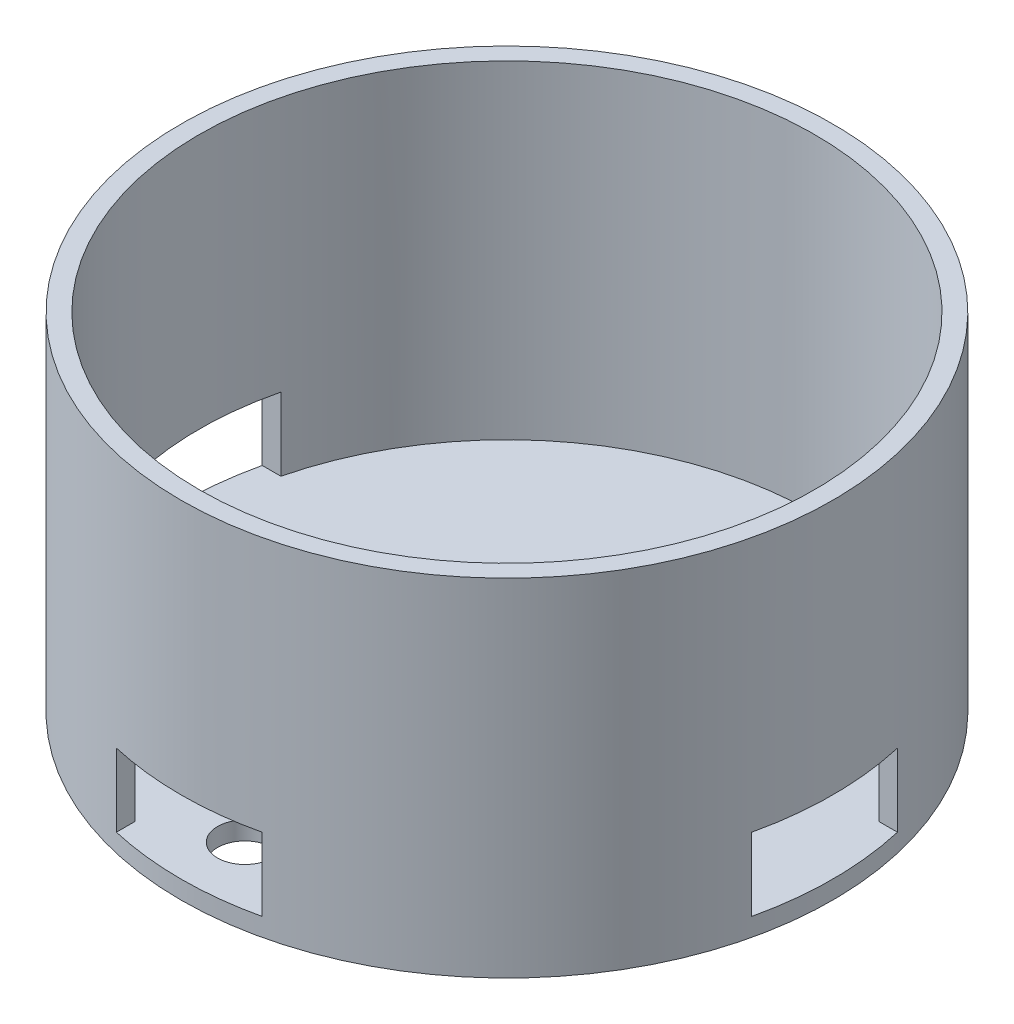
ISO-10303-21;
HEADER;
FILE_DESCRIPTION(('STEP AP214'),'2;1');
FILE_NAME('part.step','',(''),(''),'','','');
FILE_SCHEMA(('AUTOMOTIVE_DESIGN { 1 0 10303 214 1 1 1 1 }'));
ENDSEC;
DATA;
#1=APPLICATION_CONTEXT('core data for automotive mechanical design processes');
#2=APPLICATION_PROTOCOL_DEFINITION('international standard','automotive_design',2000,#1);
#3=PRODUCT_CONTEXT('',#1,'mechanical');
#4=PRODUCT('Part','Part','',(#3));
#5=PRODUCT_RELATED_PRODUCT_CATEGORY('part','',(#4));
#6=PRODUCT_DEFINITION_FORMATION('','',#4);
#7=PRODUCT_DEFINITION_CONTEXT('part definition',#1,'design');
#8=PRODUCT_DEFINITION('design','',#6,#7);
#9=PRODUCT_DEFINITION_SHAPE('','',#8);
#10=(LENGTH_UNIT() NAMED_UNIT(*) SI_UNIT(.MILLI.,.METRE.));
#11=(NAMED_UNIT(*) PLANE_ANGLE_UNIT() SI_UNIT($,.RADIAN.));
#12=(NAMED_UNIT(*) SI_UNIT($,.STERADIAN.) SOLID_ANGLE_UNIT());
#13=UNCERTAINTY_MEASURE_WITH_UNIT(LENGTH_MEASURE(1.E-05),#10,'distance_accuracy_value','');
#14=(GEOMETRIC_REPRESENTATION_CONTEXT(3) GLOBAL_UNCERTAINTY_ASSIGNED_CONTEXT((#13)) GLOBAL_UNIT_ASSIGNED_CONTEXT((#10,
#11,#12)) REPRESENTATION_CONTEXT('',''));
#15=CARTESIAN_POINT('',(0.,0.,0.));
#16=DIRECTION('',(0.,0.,1.));
#17=DIRECTION('',(1.,0.,0.));
#18=AXIS2_PLACEMENT_3D('',#15,#16,#17);
#19=CARTESIAN_POINT('',(0.,3.175,0.));
#20=DIRECTION('',(0.,-1.,0.));
#21=DIRECTION('',(0.,0.,-1.));
#22=AXIS2_PLACEMENT_3D('',#19,#20,#21);
#23=CYLINDRICAL_SURFACE('',#22,56.769);
#24=DIRECTION('',(0.,-1.,0.));
#25=VECTOR('',#24,1.);
#26=CARTESIAN_POINT('',(12.7000000000002,3.175,55.3301848993838));
#27=LINE('',#26,#25);
#28=CARTESIAN_POINT('',(12.7000000000002,15.875,55.3301848993838));
#29=VERTEX_POINT('',#28);
#30=CARTESIAN_POINT('',(12.7000000000002,3.175,55.3301848993838));
#31=VERTEX_POINT('',#30);
#32=EDGE_CURVE('E183',#29,#31,#27,.T.);
#33=ORIENTED_EDGE('',*,*,#32,.T.);
#34=CARTESIAN_POINT('',(0.,3.175,0.));
#35=DIRECTION('',(0.,-1.,0.));
#36=DIRECTION('',(0.,0.,-1.));
#37=AXIS2_PLACEMENT_3D('',#34,#35,#36);
#38=CIRCLE('',#37,56.769);
#39=CARTESIAN_POINT('',(-12.6999999999998,3.175,55.3301848993839));
#40=VERTEX_POINT('',#39);
#41=EDGE_CURVE('E137',#31,#40,#38,.T.);
#42=ORIENTED_EDGE('',*,*,#41,.T.);
#43=DIRECTION('',(0.,-1.,0.));
#44=VECTOR('',#43,1.);
#45=CARTESIAN_POINT('',(-12.6999999999998,3.175,55.3301848993839));
#46=LINE('',#45,#44);
#47=CARTESIAN_POINT('',(-12.6999999999998,15.875,55.3301848993839));
#48=VERTEX_POINT('',#47);
#49=EDGE_CURVE('E190',#40,#48,#46,.F.);
#50=ORIENTED_EDGE('',*,*,#49,.T.);
#51=CARTESIAN_POINT('',(0.,15.875,0.));
#52=DIRECTION('',(0.,1.,0.));
#53=DIRECTION('',(0.,0.,1.));
#54=AXIS2_PLACEMENT_3D('',#51,#52,#53);
#55=CIRCLE('',#54,56.769);
#56=EDGE_CURVE('E138',#48,#29,#55,.T.);
#57=ORIENTED_EDGE('',*,*,#56,.T.);
#58=EDGE_LOOP('',(#33,#42,#50,#57));
#59=FACE_BOUND('',#58,.T.);
#60=DIRECTION('',(0.,-1.,0.));
#61=VECTOR('',#60,1.);
#62=CARTESIAN_POINT('',(55.3301848993838,3.175,-12.7));
#63=LINE('',#62,#61);
#64=CARTESIAN_POINT('',(55.3301848993838,15.875,-12.7));
#65=VERTEX_POINT('',#64);
#66=CARTESIAN_POINT('',(55.3301848993838,3.175,-12.7));
#67=VERTEX_POINT('',#66);
#68=EDGE_CURVE('E129',#65,#67,#63,.T.);
#69=ORIENTED_EDGE('',*,*,#68,.T.);
#70=CARTESIAN_POINT('',(55.3301848993838,3.175,12.7));
#71=VERTEX_POINT('',#70);
#72=EDGE_CURVE('E195',#67,#71,#38,.T.);
#73=ORIENTED_EDGE('',*,*,#72,.T.);
#74=DIRECTION('',(0.,-1.,0.));
#75=VECTOR('',#74,1.);
#76=CARTESIAN_POINT('',(55.3301848993838,3.175,12.7));
#77=LINE('',#76,#75);
#78=CARTESIAN_POINT('',(55.3301848993838,15.875,12.7));
#79=VERTEX_POINT('',#78);
#80=EDGE_CURVE('E131',#71,#79,#77,.F.);
#81=ORIENTED_EDGE('',*,*,#80,.T.);
#82=EDGE_CURVE('E127',#79,#65,#55,.T.);
#83=ORIENTED_EDGE('',*,*,#82,.T.);
#84=EDGE_LOOP('',(#69,#73,#81,#83));
#85=FACE_BOUND('',#84,.T.);
#86=DIRECTION('',(0.,-1.,0.));
#87=VECTOR('',#86,1.);
#88=CARTESIAN_POINT('',(-55.3301848993838,3.175,-12.7));
#89=LINE('',#88,#87);
#90=CARTESIAN_POINT('',(-55.3301848993838,3.175,-12.7));
#91=VERTEX_POINT('',#90);
#92=CARTESIAN_POINT('',(-55.3301848993838,15.875,-12.7));
#93=VERTEX_POINT('',#92);
#94=EDGE_CURVE('E224',#91,#93,#89,.F.);
#95=ORIENTED_EDGE('',*,*,#94,.T.);
#96=CARTESIAN_POINT('',(0.,15.875,0.));
#97=DIRECTION('',(0.,1.,0.));
#98=DIRECTION('',(0.,0.,1.));
#99=AXIS2_PLACEMENT_3D('',#96,#97,#98);
#100=CIRCLE('',#99,56.769);
#101=CARTESIAN_POINT('',(-55.3301848993838,15.875,12.7));
#102=VERTEX_POINT('',#101);
#103=EDGE_CURVE('E228',#93,#102,#100,.T.);
#104=ORIENTED_EDGE('',*,*,#103,.T.);
#105=DIRECTION('',(0.,-1.,0.));
#106=VECTOR('',#105,1.);
#107=CARTESIAN_POINT('',(-55.3301848993838,3.175,12.7));
#108=LINE('',#107,#106);
#109=CARTESIAN_POINT('',(-55.3301848993838,3.175,12.7));
#110=VERTEX_POINT('',#109);
#111=EDGE_CURVE('E216',#102,#110,#108,.T.);
#112=ORIENTED_EDGE('',*,*,#111,.T.);
#113=CARTESIAN_POINT('',(0.,3.175,0.));
#114=DIRECTION('',(0.,-1.,0.));
#115=DIRECTION('',(0.,0.,-1.));
#116=AXIS2_PLACEMENT_3D('',#113,#114,#115);
#117=CIRCLE('',#116,56.769);
#118=EDGE_CURVE('E231',#110,#91,#117,.T.);
#119=ORIENTED_EDGE('',*,*,#118,.T.);
#120=EDGE_LOOP('',(#95,#104,#112,#119));
#121=FACE_BOUND('',#120,.T.);
#122=CARTESIAN_POINT('',(0.,0.,0.));
#123=DIRECTION('',(0.,1.,0.));
#124=DIRECTION('',(0.,0.,1.));
#125=AXIS2_PLACEMENT_3D('',#122,#123,#124);
#126=CIRCLE('',#125,56.769);
#127=CARTESIAN_POINT('',(0.,0.,56.769));
#128=VERTEX_POINT('',#127);
#129=EDGE_CURVE('E242',#128,#128,#126,.T.);
#130=ORIENTED_EDGE('',*,*,#129,.T.);
#131=EDGE_LOOP('',(#130));
#132=FACE_BOUND('',#131,.T.);
#133=CARTESIAN_POINT('',(0.,60.325,0.));
#134=DIRECTION('',(0.,1.,0.));
#135=DIRECTION('',(0.,0.,1.));
#136=AXIS2_PLACEMENT_3D('',#133,#134,#135);
#137=CIRCLE('',#136,56.769);
#138=CARTESIAN_POINT('',(0.,60.325,56.769));
#139=VERTEX_POINT('',#138);
#140=EDGE_CURVE('E238',#139,#139,#137,.T.);
#141=ORIENTED_EDGE('',*,*,#140,.F.);
#142=EDGE_LOOP('',(#141));
#143=FACE_BOUND('',#142,.T.);
#144=ADVANCED_FACE('F38',(#59,#85,#121,#132,#143),#23,.T.);
#145=CARTESIAN_POINT('',(0.,0.,0.));
#146=DIRECTION('',(0.,1.,0.));
#147=DIRECTION('',(0.,0.,1.));
#148=AXIS2_PLACEMENT_3D('',#145,#146,#147);
#149=PLANE('',#148);
#150=CARTESIAN_POINT('',(0.,0.,-45.640625));
#151=DIRECTION('',(0.,1.,0.));
#152=DIRECTION('',(0.,0.,1.));
#153=AXIS2_PLACEMENT_3D('',#150,#151,#152);
#154=CIRCLE('',#153,4.7625);
#155=CARTESIAN_POINT('',(0.,0.,-40.878125));
#156=VERTEX_POINT('',#155);
#157=EDGE_CURVE('E157',#156,#156,#154,.T.);
#158=ORIENTED_EDGE('',*,*,#157,.T.);
#159=EDGE_LOOP('',(#158));
#160=FACE_BOUND('',#159,.T.);
#161=CARTESIAN_POINT('',(0.,0.,-27.384375));
#162=DIRECTION('',(0.,1.,0.));
#163=DIRECTION('',(0.,0.,1.));
#164=AXIS2_PLACEMENT_3D('',#161,#162,#163);
#165=CIRCLE('',#164,4.7625);
#166=CARTESIAN_POINT('',(0.,0.,-22.621875));
#167=VERTEX_POINT('',#166);
#168=EDGE_CURVE('E426',#167,#167,#165,.T.);
#169=ORIENTED_EDGE('',*,*,#168,.T.);
#170=EDGE_LOOP('',(#169));
#171=FACE_BOUND('',#170,.T.);
#172=CARTESIAN_POINT('',(0.,0.,-9.128125));
#173=DIRECTION('',(0.,1.,0.));
#174=DIRECTION('',(0.,0.,1.));
#175=AXIS2_PLACEMENT_3D('',#172,#173,#174);
#176=CIRCLE('',#175,4.7625);
#177=CARTESIAN_POINT('',(0.,0.,-4.365625));
#178=VERTEX_POINT('',#177);
#179=EDGE_CURVE('E438',#178,#178,#176,.T.);
#180=ORIENTED_EDGE('',*,*,#179,.T.);
#181=EDGE_LOOP('',(#180));
#182=FACE_BOUND('',#181,.T.);
#183=CARTESIAN_POINT('',(0.,0.,9.128125));
#184=DIRECTION('',(0.,1.,0.));
#185=DIRECTION('',(0.,0.,1.));
#186=AXIS2_PLACEMENT_3D('',#183,#184,#185);
#187=CIRCLE('',#186,4.7625);
#188=CARTESIAN_POINT('',(0.,0.,13.890625));
#189=VERTEX_POINT('',#188);
#190=EDGE_CURVE('E446',#189,#189,#187,.T.);
#191=ORIENTED_EDGE('',*,*,#190,.T.);
#192=EDGE_LOOP('',(#191));
#193=FACE_BOUND('',#192,.T.);
#194=CARTESIAN_POINT('',(0.,0.,27.384375));
#195=DIRECTION('',(0.,1.,0.));
#196=DIRECTION('',(0.,0.,1.));
#197=AXIS2_PLACEMENT_3D('',#194,#195,#196);
#198=CIRCLE('',#197,4.7625);
#199=CARTESIAN_POINT('',(0.,0.,32.146875));
#200=VERTEX_POINT('',#199);
#201=EDGE_CURVE('E454',#200,#200,#198,.T.);
#202=ORIENTED_EDGE('',*,*,#201,.T.);
#203=EDGE_LOOP('',(#202));
#204=FACE_BOUND('',#203,.T.);
#205=CARTESIAN_POINT('',(0.,0.,45.640625));
#206=DIRECTION('',(0.,1.,0.));
#207=DIRECTION('',(0.,0.,1.));
#208=AXIS2_PLACEMENT_3D('',#205,#206,#207);
#209=CIRCLE('',#208,4.7625);
#210=CARTESIAN_POINT('',(0.,0.,50.403125));
#211=VERTEX_POINT('',#210);
#212=EDGE_CURVE('E462',#211,#211,#209,.T.);
#213=ORIENTED_EDGE('',*,*,#212,.T.);
#214=EDGE_LOOP('',(#213));
#215=FACE_BOUND('',#214,.T.);
#216=ORIENTED_EDGE('',*,*,#129,.F.);
#217=EDGE_LOOP('',(#216));
#218=FACE_BOUND('',#217,.T.);
#219=ADVANCED_FACE('F302',(#160,#171,#182,#193,#204,#215,#218),#149,.F.);
#220=CARTESIAN_POINT('',(0.,60.325,0.));
#221=DIRECTION('',(0.,1.,0.));
#222=DIRECTION('',(0.,0.,1.));
#223=AXIS2_PLACEMENT_3D('',#220,#221,#222);
#224=PLANE('',#223);
#225=ORIENTED_EDGE('',*,*,#140,.T.);
#226=EDGE_LOOP('',(#225));
#227=FACE_BOUND('',#226,.T.);
#228=CARTESIAN_POINT('',(0.,60.325,0.));
#229=DIRECTION('',(0.,1.,0.));
#230=DIRECTION('',(0.,0.,1.));
#231=AXIS2_PLACEMENT_3D('',#228,#229,#230);
#232=CIRCLE('',#231,53.594);
#233=CARTESIAN_POINT('',(0.,60.325,53.594));
#234=VERTEX_POINT('',#233);
#235=EDGE_CURVE('E234',#234,#234,#232,.T.);
#236=ORIENTED_EDGE('',*,*,#235,.F.);
#237=EDGE_LOOP('',(#236));
#238=FACE_BOUND('',#237,.T.);
#239=ADVANCED_FACE('F307',(#227,#238),#224,.T.);
#240=CARTESIAN_POINT('',(0.,60.325,0.));
#241=DIRECTION('',(0.,-1.,0.));
#242=DIRECTION('',(0.,0.,-1.));
#243=AXIS2_PLACEMENT_3D('',#240,#241,#242);
#244=CYLINDRICAL_SURFACE('',#243,53.594);
#245=DIRECTION('',(0.,-1.,0.));
#246=VECTOR('',#245,1.);
#247=CARTESIAN_POINT('',(-12.6999999999998,60.325,52.0675218922507));
#248=LINE('',#247,#246);
#249=CARTESIAN_POINT('',(-12.6999999999998,3.175,52.0675218922507));
#250=VERTEX_POINT('',#249);
#251=CARTESIAN_POINT('',(-12.6999999999998,15.875,52.0675218922507));
#252=VERTEX_POINT('',#251);
#253=EDGE_CURVE('E187',#250,#252,#248,.F.);
#254=ORIENTED_EDGE('',*,*,#253,.F.);
#255=CARTESIAN_POINT('',(0.,3.175,0.));
#256=DIRECTION('',(0.,1.,0.));
#257=DIRECTION('',(0.,0.,1.));
#258=AXIS2_PLACEMENT_3D('',#255,#256,#257);
#259=CIRCLE('',#258,53.594);
#260=CARTESIAN_POINT('',(-52.0675218922507,3.175,12.7));
#261=VERTEX_POINT('',#260);
#262=EDGE_CURVE('E246',#250,#261,#259,.F.);
#263=ORIENTED_EDGE('',*,*,#262,.T.);
#264=DIRECTION('',(0.,-1.,0.));
#265=VECTOR('',#264,1.);
#266=CARTESIAN_POINT('',(-52.0675218922507,60.325,12.7));
#267=LINE('',#266,#265);
#268=CARTESIAN_POINT('',(-52.0675218922507,15.875,12.7));
#269=VERTEX_POINT('',#268);
#270=EDGE_CURVE('E202',#269,#261,#267,.T.);
#271=ORIENTED_EDGE('',*,*,#270,.F.);
#272=CARTESIAN_POINT('',(0.,15.875,0.));
#273=DIRECTION('',(0.,1.,0.));
#274=DIRECTION('',(0.,0.,1.));
#275=AXIS2_PLACEMENT_3D('',#272,#273,#274);
#276=CIRCLE('',#275,53.594);
#277=CARTESIAN_POINT('',(-52.0675218922507,15.875,-12.7));
#278=VERTEX_POINT('',#277);
#279=EDGE_CURVE('E250',#278,#269,#276,.T.);
#280=ORIENTED_EDGE('',*,*,#279,.F.);
#281=DIRECTION('',(0.,-1.,0.));
#282=VECTOR('',#281,1.);
#283=CARTESIAN_POINT('',(-52.0675218922507,60.325,-12.7));
#284=LINE('',#283,#282);
#285=CARTESIAN_POINT('',(-52.0675218922507,3.175,-12.7));
#286=VERTEX_POINT('',#285);
#287=EDGE_CURVE('E220',#286,#278,#284,.F.);
#288=ORIENTED_EDGE('',*,*,#287,.F.);
#289=CARTESIAN_POINT('',(52.0675218922507,3.175,-12.7));
#290=VERTEX_POINT('',#289);
#291=EDGE_CURVE('E247',#286,#290,#259,.F.);
#292=ORIENTED_EDGE('',*,*,#291,.T.);
#293=DIRECTION('',(0.,-1.,0.));
#294=VECTOR('',#293,1.);
#295=CARTESIAN_POINT('',(52.0675218922507,60.325,-12.7));
#296=LINE('',#295,#294);
#297=CARTESIAN_POINT('',(52.0675218922507,15.875,-12.7));
#298=VERTEX_POINT('',#297);
#299=EDGE_CURVE('E145',#298,#290,#296,.T.);
#300=ORIENTED_EDGE('',*,*,#299,.F.);
#301=CARTESIAN_POINT('',(0.,15.875,0.));
#302=DIRECTION('',(0.,1.,0.));
#303=DIRECTION('',(0.,0.,1.));
#304=AXIS2_PLACEMENT_3D('',#301,#302,#303);
#305=CIRCLE('',#304,53.594);
#306=CARTESIAN_POINT('',(52.0675218922507,15.875,12.7));
#307=VERTEX_POINT('',#306);
#308=EDGE_CURVE('E41',#307,#298,#305,.T.);
#309=ORIENTED_EDGE('',*,*,#308,.F.);
#310=DIRECTION('',(0.,-1.,0.));
#311=VECTOR('',#310,1.);
#312=CARTESIAN_POINT('',(52.0675218922507,60.325,12.7));
#313=LINE('',#312,#311);
#314=CARTESIAN_POINT('',(52.0675218922507,3.175,12.7));
#315=VERTEX_POINT('',#314);
#316=EDGE_CURVE('E144',#315,#307,#313,.F.);
#317=ORIENTED_EDGE('',*,*,#316,.F.);
#318=CARTESIAN_POINT('',(12.7000000000002,3.175,52.0675218922506));
#319=VERTEX_POINT('',#318);
#320=EDGE_CURVE('E251',#315,#319,#259,.F.);
#321=ORIENTED_EDGE('',*,*,#320,.T.);
#322=DIRECTION('',(0.,-1.,0.));
#323=VECTOR('',#322,1.);
#324=CARTESIAN_POINT('',(12.7000000000002,60.325,52.0675218922506));
#325=LINE('',#324,#323);
#326=CARTESIAN_POINT('',(12.7000000000002,15.875,52.0675218922506));
#327=VERTEX_POINT('',#326);
#328=EDGE_CURVE('E180',#327,#319,#325,.T.);
#329=ORIENTED_EDGE('',*,*,#328,.F.);
#330=EDGE_CURVE('E11',#252,#327,#305,.T.);
#331=ORIENTED_EDGE('',*,*,#330,.F.);
#332=EDGE_LOOP('',(#254,#263,#271,#280,#288,#292,#300,#309,#317,#321,#329,#331));
#333=FACE_BOUND('',#332,.T.);
#334=ORIENTED_EDGE('',*,*,#235,.T.);
#335=EDGE_LOOP('',(#334));
#336=FACE_BOUND('',#335,.T.);
#337=ADVANCED_FACE('F267',(#333,#336),#244,.F.);
#338=CARTESIAN_POINT('',(0.,3.175,0.));
#339=DIRECTION('',(0.,1.,0.));
#340=DIRECTION('',(0.,0.,1.));
#341=AXIS2_PLACEMENT_3D('',#338,#339,#340);
#342=PLANE('',#341);
#343=CARTESIAN_POINT('',(0.,3.175,-45.640625));
#344=DIRECTION('',(0.,1.,0.));
#345=DIRECTION('',(0.,0.,1.));
#346=AXIS2_PLACEMENT_3D('',#343,#344,#345);
#347=CIRCLE('',#346,4.7625);
#348=CARTESIAN_POINT('',(0.,3.175,-40.878125));
#349=VERTEX_POINT('',#348);
#350=EDGE_CURVE('E424',#349,#349,#347,.T.);
#351=ORIENTED_EDGE('',*,*,#350,.F.);
#352=EDGE_LOOP('',(#351));
#353=FACE_BOUND('',#352,.T.);
#354=CARTESIAN_POINT('',(0.,3.175,-27.384375));
#355=DIRECTION('',(0.,1.,0.));
#356=DIRECTION('',(0.,0.,1.));
#357=AXIS2_PLACEMENT_3D('',#354,#355,#356);
#358=CIRCLE('',#357,4.7625);
#359=CARTESIAN_POINT('',(0.,3.175,-22.621875));
#360=VERTEX_POINT('',#359);
#361=EDGE_CURVE('E432',#360,#360,#358,.T.);
#362=ORIENTED_EDGE('',*,*,#361,.F.);
#363=EDGE_LOOP('',(#362));
#364=FACE_BOUND('',#363,.T.);
#365=CARTESIAN_POINT('',(0.,3.175,-9.128125));
#366=DIRECTION('',(0.,1.,0.));
#367=DIRECTION('',(0.,0.,1.));
#368=AXIS2_PLACEMENT_3D('',#365,#366,#367);
#369=CIRCLE('',#368,4.7625);
#370=CARTESIAN_POINT('',(0.,3.175,-4.365625));
#371=VERTEX_POINT('',#370);
#372=EDGE_CURVE('E442',#371,#371,#369,.T.);
#373=ORIENTED_EDGE('',*,*,#372,.F.);
#374=EDGE_LOOP('',(#373));
#375=FACE_BOUND('',#374,.T.);
#376=CARTESIAN_POINT('',(0.,3.175,9.128125));
#377=DIRECTION('',(0.,1.,0.));
#378=DIRECTION('',(0.,0.,1.));
#379=AXIS2_PLACEMENT_3D('',#376,#377,#378);
#380=CIRCLE('',#379,4.7625);
#381=CARTESIAN_POINT('',(0.,3.175,13.890625));
#382=VERTEX_POINT('',#381);
#383=EDGE_CURVE('E450',#382,#382,#380,.T.);
#384=ORIENTED_EDGE('',*,*,#383,.F.);
#385=EDGE_LOOP('',(#384));
#386=FACE_BOUND('',#385,.T.);
#387=CARTESIAN_POINT('',(0.,3.175,27.384375));
#388=DIRECTION('',(0.,1.,0.));
#389=DIRECTION('',(0.,0.,1.));
#390=AXIS2_PLACEMENT_3D('',#387,#388,#389);
#391=CIRCLE('',#390,4.7625);
#392=CARTESIAN_POINT('',(0.,3.175,32.146875));
#393=VERTEX_POINT('',#392);
#394=EDGE_CURVE('E458',#393,#393,#391,.T.);
#395=ORIENTED_EDGE('',*,*,#394,.F.);
#396=EDGE_LOOP('',(#395));
#397=FACE_BOUND('',#396,.T.);
#398=CARTESIAN_POINT('',(0.,3.175,45.640625));
#399=DIRECTION('',(0.,1.,0.));
#400=DIRECTION('',(0.,0.,1.));
#401=AXIS2_PLACEMENT_3D('',#398,#399,#400);
#402=CIRCLE('',#401,4.7625);
#403=CARTESIAN_POINT('',(0.,3.175,50.403125));
#404=VERTEX_POINT('',#403);
#405=EDGE_CURVE('E466',#404,#404,#402,.T.);
#406=ORIENTED_EDGE('',*,*,#405,.F.);
#407=EDGE_LOOP('',(#406));
#408=FACE_BOUND('',#407,.T.);
#409=ORIENTED_EDGE('',*,*,#262,.F.);
#410=DIRECTION('',(0.,0.,-1.));
#411=VECTOR('',#410,1.);
#412=CARTESIAN_POINT('',(-12.6999999999998,3.175,56.7690000000002));
#413=LINE('',#412,#411);
#414=EDGE_CURVE('E161',#40,#250,#413,.T.);
#415=ORIENTED_EDGE('',*,*,#414,.F.);
#416=ORIENTED_EDGE('',*,*,#41,.F.);
#417=DIRECTION('',(0.,0.,-1.));
#418=VECTOR('',#417,1.);
#419=CARTESIAN_POINT('',(12.7000000000002,3.175,56.7690000000002));
#420=LINE('',#419,#418);
#421=EDGE_CURVE('E164',#31,#319,#420,.T.);
#422=ORIENTED_EDGE('',*,*,#421,.T.);
#423=ORIENTED_EDGE('',*,*,#320,.F.);
#424=DIRECTION('',(-1.,0.,0.));
#425=VECTOR('',#424,1.);
#426=CARTESIAN_POINT('',(56.769,3.175,12.7));
#427=LINE('',#426,#425);
#428=EDGE_CURVE('E155',#71,#315,#427,.T.);
#429=ORIENTED_EDGE('',*,*,#428,.F.);
#430=ORIENTED_EDGE('',*,*,#72,.F.);
#431=DIRECTION('',(-1.,0.,0.));
#432=VECTOR('',#431,1.);
#433=CARTESIAN_POINT('',(56.769,3.175,-12.7));
#434=LINE('',#433,#432);
#435=EDGE_CURVE('E53',#67,#290,#434,.T.);
#436=ORIENTED_EDGE('',*,*,#435,.T.);
#437=ORIENTED_EDGE('',*,*,#291,.F.);
#438=DIRECTION('',(1.,0.,0.));
#439=VECTOR('',#438,1.);
#440=CARTESIAN_POINT('',(-56.769,3.175,-12.7));
#441=LINE('',#440,#439);
#442=EDGE_CURVE('E199',#91,#286,#441,.T.);
#443=ORIENTED_EDGE('',*,*,#442,.F.);
#444=ORIENTED_EDGE('',*,*,#118,.F.);
#445=DIRECTION('',(1.,0.,0.));
#446=VECTOR('',#445,1.);
#447=CARTESIAN_POINT('',(-56.769,3.175,12.7));
#448=LINE('',#447,#446);
#449=EDGE_CURVE('E203',#110,#261,#448,.T.);
#450=ORIENTED_EDGE('',*,*,#449,.T.);
#451=EDGE_LOOP('',(#409,#415,#416,#422,#423,#429,#430,#436,#437,#443,#444,#450));
#452=FACE_BOUND('',#451,.T.);
#453=ADVANCED_FACE('F280',(#353,#364,#375,#386,#397,#408,#452),#342,.T.);
#454=CARTESIAN_POINT('',(-56.769,15.875,12.7));
#455=DIRECTION('',(0.,1.,0.));
#456=DIRECTION('',(0.,0.,1.));
#457=AXIS2_PLACEMENT_3D('',#454,#455,#456);
#458=PLANE('',#457);
#459=DIRECTION('',(1.,0.,0.));
#460=VECTOR('',#459,1.);
#461=CARTESIAN_POINT('',(-56.769,15.875,-12.7));
#462=LINE('',#461,#460);
#463=EDGE_CURVE('E198',#93,#278,#462,.T.);
#464=ORIENTED_EDGE('',*,*,#463,.T.);
#465=ORIENTED_EDGE('',*,*,#279,.T.);
#466=DIRECTION('',(1.,0.,0.));
#467=VECTOR('',#466,1.);
#468=CARTESIAN_POINT('',(-56.769,15.875,12.7));
#469=LINE('',#468,#467);
#470=EDGE_CURVE('E207',#102,#269,#469,.T.);
#471=ORIENTED_EDGE('',*,*,#470,.F.);
#472=ORIENTED_EDGE('',*,*,#103,.F.);
#473=EDGE_LOOP('',(#464,#465,#471,#472));
#474=FACE_BOUND('',#473,.T.);
#475=ADVANCED_FACE('F257',(#474),#458,.F.);
#476=CARTESIAN_POINT('',(-56.769,3.175,-12.7));
#477=DIRECTION('',(0.,0.,-1.));
#478=DIRECTION('',(-1.,0.,0.));
#479=AXIS2_PLACEMENT_3D('',#476,#477,#478);
#480=PLANE('',#479);
#481=ORIENTED_EDGE('',*,*,#442,.T.);
#482=ORIENTED_EDGE('',*,*,#287,.T.);
#483=ORIENTED_EDGE('',*,*,#463,.F.);
#484=ORIENTED_EDGE('',*,*,#94,.F.);
#485=EDGE_LOOP('',(#481,#482,#483,#484));
#486=FACE_BOUND('',#485,.T.);
#487=ADVANCED_FACE('F322',(#486),#480,.F.);
#488=CARTESIAN_POINT('',(-56.769,3.175,12.7));
#489=DIRECTION('',(0.,0.,1.));
#490=DIRECTION('',(1.,0.,0.));
#491=AXIS2_PLACEMENT_3D('',#488,#489,#490);
#492=PLANE('',#491);
#493=ORIENTED_EDGE('',*,*,#470,.T.);
#494=ORIENTED_EDGE('',*,*,#270,.T.);
#495=ORIENTED_EDGE('',*,*,#449,.F.);
#496=ORIENTED_EDGE('',*,*,#111,.F.);
#497=EDGE_LOOP('',(#493,#494,#495,#496));
#498=FACE_BOUND('',#497,.T.);
#499=ADVANCED_FACE('F264',(#498),#492,.F.);
#500=CARTESIAN_POINT('',(56.769,3.175,-12.7));
#501=DIRECTION('',(0.,0.,-1.));
#502=DIRECTION('',(-1.,0.,0.));
#503=AXIS2_PLACEMENT_3D('',#500,#501,#502);
#504=PLANE('',#503);
#505=DIRECTION('',(-1.,0.,0.));
#506=VECTOR('',#505,1.);
#507=CARTESIAN_POINT('',(56.769,15.875,-12.7));
#508=LINE('',#507,#506);
#509=EDGE_CURVE('E141',#65,#298,#508,.T.);
#510=ORIENTED_EDGE('',*,*,#509,.T.);
#511=ORIENTED_EDGE('',*,*,#299,.T.);
#512=ORIENTED_EDGE('',*,*,#435,.F.);
#513=ORIENTED_EDGE('',*,*,#68,.F.);
#514=EDGE_LOOP('',(#510,#511,#512,#513));
#515=FACE_BOUND('',#514,.T.);
#516=ADVANCED_FACE('F140',(#515),#504,.F.);
#517=CARTESIAN_POINT('',(56.769,3.175,12.7));
#518=DIRECTION('',(0.,0.,1.));
#519=DIRECTION('',(1.,0.,0.));
#520=AXIS2_PLACEMENT_3D('',#517,#518,#519);
#521=PLANE('',#520);
#522=ORIENTED_EDGE('',*,*,#428,.T.);
#523=ORIENTED_EDGE('',*,*,#316,.T.);
#524=DIRECTION('',(-1.,0.,0.));
#525=VECTOR('',#524,1.);
#526=CARTESIAN_POINT('',(56.769,15.875,12.7));
#527=LINE('',#526,#525);
#528=EDGE_CURVE('E151',#79,#307,#527,.T.);
#529=ORIENTED_EDGE('',*,*,#528,.F.);
#530=ORIENTED_EDGE('',*,*,#80,.F.);
#531=EDGE_LOOP('',(#522,#523,#529,#530));
#532=FACE_BOUND('',#531,.T.);
#533=ADVANCED_FACE('F331',(#532),#521,.F.);
#534=CARTESIAN_POINT('',(12.7000000000002,15.875,56.7690000000002));
#535=DIRECTION('',(0.,1.,0.));
#536=DIRECTION('',(0.,0.,1.));
#537=AXIS2_PLACEMENT_3D('',#534,#535,#536);
#538=PLANE('',#537);
#539=ORIENTED_EDGE('',*,*,#528,.T.);
#540=ORIENTED_EDGE('',*,*,#308,.T.);
#541=ORIENTED_EDGE('',*,*,#509,.F.);
#542=ORIENTED_EDGE('',*,*,#82,.F.);
#543=EDGE_LOOP('',(#539,#540,#541,#542));
#544=FACE_BOUND('',#543,.T.);
#545=ADVANCED_FACE('F147',(#544),#538,.F.);
#546=ORIENTED_EDGE('',*,*,#56,.F.);
#547=DIRECTION('',(0.,0.,-1.));
#548=VECTOR('',#547,1.);
#549=CARTESIAN_POINT('',(-12.6999999999998,15.875,56.7690000000002));
#550=LINE('',#549,#548);
#551=EDGE_CURVE('E60',#48,#252,#550,.T.);
#552=ORIENTED_EDGE('',*,*,#551,.T.);
#553=ORIENTED_EDGE('',*,*,#330,.T.);
#554=DIRECTION('',(0.,0.,-1.));
#555=VECTOR('',#554,1.);
#556=CARTESIAN_POINT('',(12.7000000000002,15.875,56.7690000000002));
#557=LINE('',#556,#555);
#558=EDGE_CURVE('E168',#29,#327,#557,.T.);
#559=ORIENTED_EDGE('',*,*,#558,.F.);
#560=EDGE_LOOP('',(#546,#552,#553,#559));
#561=FACE_BOUND('',#560,.T.);
#562=ADVANCED_FACE('F288',(#561),#538,.F.);
#563=CARTESIAN_POINT('',(-12.6999999999998,3.175,56.7690000000002));
#564=DIRECTION('',(-1.,0.,0.));
#565=DIRECTION('',(0.,0.,1.));
#566=AXIS2_PLACEMENT_3D('',#563,#564,#565);
#567=PLANE('',#566);
#568=ORIENTED_EDGE('',*,*,#414,.T.);
#569=ORIENTED_EDGE('',*,*,#253,.T.);
#570=ORIENTED_EDGE('',*,*,#551,.F.);
#571=ORIENTED_EDGE('',*,*,#49,.F.);
#572=EDGE_LOOP('',(#568,#569,#570,#571));
#573=FACE_BOUND('',#572,.T.);
#574=ADVANCED_FACE('F290',(#573),#567,.F.);
#575=CARTESIAN_POINT('',(12.7000000000002,3.175,56.7690000000002));
#576=DIRECTION('',(1.,0.,0.));
#577=DIRECTION('',(0.,0.,-1.));
#578=AXIS2_PLACEMENT_3D('',#575,#576,#577);
#579=PLANE('',#578);
#580=ORIENTED_EDGE('',*,*,#558,.T.);
#581=ORIENTED_EDGE('',*,*,#328,.T.);
#582=ORIENTED_EDGE('',*,*,#421,.F.);
#583=ORIENTED_EDGE('',*,*,#32,.F.);
#584=EDGE_LOOP('',(#580,#581,#582,#583));
#585=FACE_BOUND('',#584,.T.);
#586=ADVANCED_FACE('F284',(#585),#579,.F.);
#587=CARTESIAN_POINT('',(0.,0.,45.640625));
#588=DIRECTION('',(0.,1.,0.));
#589=DIRECTION('',(0.,0.,1.));
#590=AXIS2_PLACEMENT_3D('',#587,#588,#589);
#591=CYLINDRICAL_SURFACE('',#590,4.7625);
#592=ORIENTED_EDGE('',*,*,#212,.F.);
#593=EDGE_LOOP('',(#592));
#594=FACE_BOUND('',#593,.T.);
#595=ORIENTED_EDGE('',*,*,#405,.T.);
#596=EDGE_LOOP('',(#595));
#597=FACE_BOUND('',#596,.T.);
#598=ADVANCED_FACE('F297',(#594,#597),#591,.F.);
#599=CARTESIAN_POINT('',(0.,0.,27.384375));
#600=DIRECTION('',(0.,1.,0.));
#601=DIRECTION('',(0.,0.,1.));
#602=AXIS2_PLACEMENT_3D('',#599,#600,#601);
#603=CYLINDRICAL_SURFACE('',#602,4.7625);
#604=ORIENTED_EDGE('',*,*,#201,.F.);
#605=EDGE_LOOP('',(#604));
#606=FACE_BOUND('',#605,.T.);
#607=ORIENTED_EDGE('',*,*,#394,.T.);
#608=EDGE_LOOP('',(#607));
#609=FACE_BOUND('',#608,.T.);
#610=ADVANCED_FACE('F368',(#606,#609),#603,.F.);
#611=CARTESIAN_POINT('',(0.,0.,9.128125));
#612=DIRECTION('',(0.,1.,0.));
#613=DIRECTION('',(0.,0.,1.));
#614=AXIS2_PLACEMENT_3D('',#611,#612,#613);
#615=CYLINDRICAL_SURFACE('',#614,4.7625);
#616=ORIENTED_EDGE('',*,*,#190,.F.);
#617=EDGE_LOOP('',(#616));
#618=FACE_BOUND('',#617,.T.);
#619=ORIENTED_EDGE('',*,*,#383,.T.);
#620=EDGE_LOOP('',(#619));
#621=FACE_BOUND('',#620,.T.);
#622=ADVANCED_FACE('F374',(#618,#621),#615,.F.);
#623=CARTESIAN_POINT('',(0.,0.,-9.128125));
#624=DIRECTION('',(0.,1.,0.));
#625=DIRECTION('',(0.,0.,1.));
#626=AXIS2_PLACEMENT_3D('',#623,#624,#625);
#627=CYLINDRICAL_SURFACE('',#626,4.7625);
#628=ORIENTED_EDGE('',*,*,#179,.F.);
#629=EDGE_LOOP('',(#628));
#630=FACE_BOUND('',#629,.T.);
#631=ORIENTED_EDGE('',*,*,#372,.T.);
#632=EDGE_LOOP('',(#631));
#633=FACE_BOUND('',#632,.T.);
#634=ADVANCED_FACE('F381',(#630,#633),#627,.F.);
#635=CARTESIAN_POINT('',(0.,0.,-27.384375));
#636=DIRECTION('',(0.,1.,0.));
#637=DIRECTION('',(0.,0.,1.));
#638=AXIS2_PLACEMENT_3D('',#635,#636,#637);
#639=CYLINDRICAL_SURFACE('',#638,4.7625);
#640=ORIENTED_EDGE('',*,*,#168,.F.);
#641=EDGE_LOOP('',(#640));
#642=FACE_BOUND('',#641,.T.);
#643=ORIENTED_EDGE('',*,*,#361,.T.);
#644=EDGE_LOOP('',(#643));
#645=FACE_BOUND('',#644,.T.);
#646=ADVANCED_FACE('F389',(#642,#645),#639,.F.);
#647=CARTESIAN_POINT('',(0.,0.,-45.640625));
#648=DIRECTION('',(0.,1.,0.));
#649=DIRECTION('',(0.,0.,1.));
#650=AXIS2_PLACEMENT_3D('',#647,#648,#649);
#651=CYLINDRICAL_SURFACE('',#650,4.7625);
#652=ORIENTED_EDGE('',*,*,#157,.F.);
#653=EDGE_LOOP('',(#652));
#654=FACE_BOUND('',#653,.T.);
#655=ORIENTED_EDGE('',*,*,#350,.T.);
#656=EDGE_LOOP('',(#655));
#657=FACE_BOUND('',#656,.T.);
#658=ADVANCED_FACE('F397',(#654,#657),#651,.F.);
#659=CLOSED_SHELL('',(#144,#219,#239,#337,#453,#475,#487,#499,#516,#533,#545,#562,#574,#586,
#598,#610,#622,#634,#646,#658));
#660=MANIFOLD_SOLID_BREP('B2',#659);
#661=ADVANCED_BREP_SHAPE_REPRESENTATION('',(#18,#660),#14);
#662=SHAPE_DEFINITION_REPRESENTATION(#9,#661);
ENDSEC;
END-ISO-10303-21;
